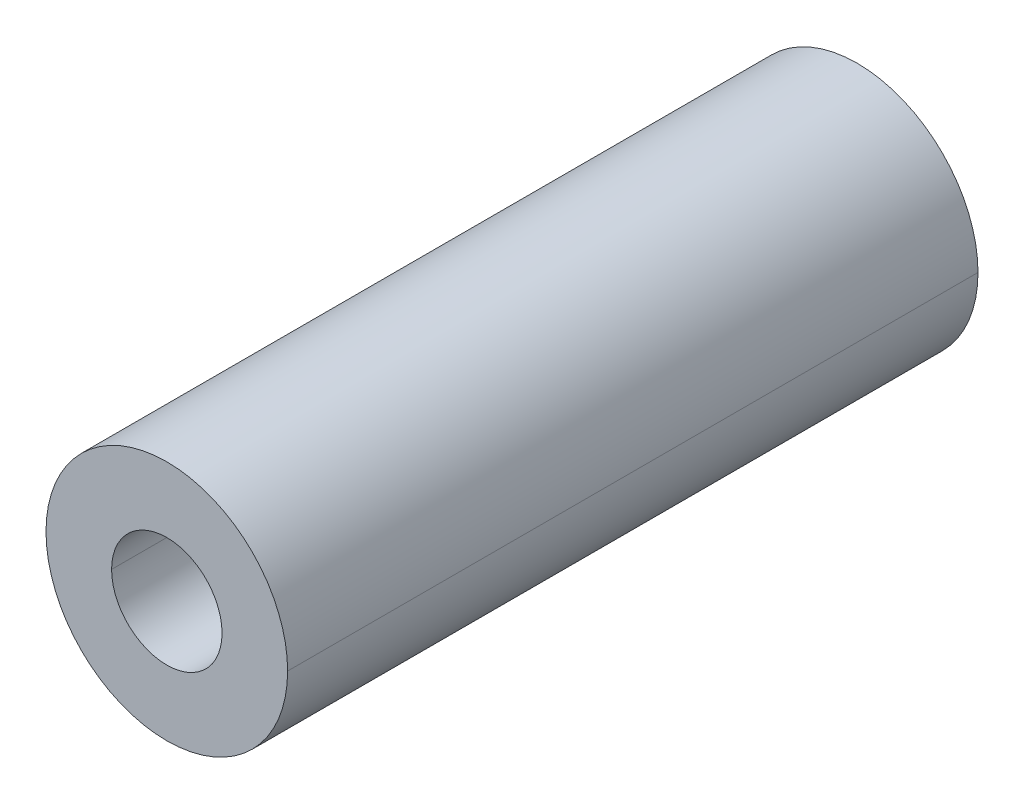
ISO-10303-21;
HEADER;
FILE_DESCRIPTION(('STEP AP214'),'2;1');
FILE_NAME('part.step','',(''),(''),'','','');
FILE_SCHEMA(('AUTOMOTIVE_DESIGN { 1 0 10303 214 1 1 1 1 }'));
ENDSEC;
DATA;
#1=APPLICATION_CONTEXT('core data for automotive mechanical design processes');
#2=APPLICATION_PROTOCOL_DEFINITION('international standard','automotive_design',2000,#1);
#3=PRODUCT_CONTEXT('',#1,'mechanical');
#4=PRODUCT('Part','Part','',(#3));
#5=PRODUCT_RELATED_PRODUCT_CATEGORY('part','',(#4));
#6=PRODUCT_DEFINITION_FORMATION('','',#4);
#7=PRODUCT_DEFINITION_CONTEXT('part definition',#1,'design');
#8=PRODUCT_DEFINITION('design','',#6,#7);
#9=PRODUCT_DEFINITION_SHAPE('','',#8);
#10=(LENGTH_UNIT() NAMED_UNIT(*) SI_UNIT(.MILLI.,.METRE.));
#11=(NAMED_UNIT(*) PLANE_ANGLE_UNIT() SI_UNIT($,.RADIAN.));
#12=(NAMED_UNIT(*) SI_UNIT($,.STERADIAN.) SOLID_ANGLE_UNIT());
#13=UNCERTAINTY_MEASURE_WITH_UNIT(LENGTH_MEASURE(1.E-05),#10,'distance_accuracy_value','');
#14=(GEOMETRIC_REPRESENTATION_CONTEXT(3) GLOBAL_UNCERTAINTY_ASSIGNED_CONTEXT((#13)) GLOBAL_UNIT_ASSIGNED_CONTEXT((#10,
#11,#12)) REPRESENTATION_CONTEXT('',''));
#15=CARTESIAN_POINT('',(0.,0.,0.));
#16=DIRECTION('',(0.,0.,1.));
#17=DIRECTION('',(1.,0.,0.));
#18=AXIS2_PLACEMENT_3D('',#15,#16,#17);
#19=CARTESIAN_POINT('',(0.,0.,0.));
#20=DIRECTION('',(0.,0.,1.));
#21=DIRECTION('',(-1.,0.,0.));
#22=AXIS2_PLACEMENT_3D('',#19,#20,#21);
#23=CYLINDRICAL_SURFACE('',#22,1.6);
#24=DIRECTION('',(0.,0.,1.));
#25=VECTOR('',#24,1.);
#26=CARTESIAN_POINT('',(-1.6,0.,0.));
#27=LINE('',#26,#25);
#28=CARTESIAN_POINT('',(-1.6,0.,0.));
#29=VERTEX_POINT('',#28);
#30=CARTESIAN_POINT('',(-1.6,0.,20.));
#31=VERTEX_POINT('',#30);
#32=EDGE_CURVE('E24',#29,#31,#27,.T.);
#33=ORIENTED_EDGE('',*,*,#32,.T.);
#34=CARTESIAN_POINT('',(0.,0.,20.));
#35=DIRECTION('',(0.,0.,-1.));
#36=DIRECTION('',(1.,0.,0.));
#37=AXIS2_PLACEMENT_3D('',#34,#35,#36);
#38=CIRCLE('',#37,1.6);
#39=CARTESIAN_POINT('',(1.6,0.,20.));
#40=VERTEX_POINT('',#39);
#41=EDGE_CURVE('E31',#40,#31,#38,.T.);
#42=ORIENTED_EDGE('',*,*,#41,.F.);
#43=DIRECTION('',(0.,0.,1.));
#44=VECTOR('',#43,1.);
#45=CARTESIAN_POINT('',(1.6,0.,0.));
#46=LINE('',#45,#44);
#47=CARTESIAN_POINT('',(1.6,0.,0.));
#48=VERTEX_POINT('',#47);
#49=EDGE_CURVE('E11',#48,#40,#46,.T.);
#50=ORIENTED_EDGE('',*,*,#49,.F.);
#51=CARTESIAN_POINT('',(0.,0.,0.));
#52=DIRECTION('',(0.,0.,-1.));
#53=DIRECTION('',(1.,0.,0.));
#54=AXIS2_PLACEMENT_3D('',#51,#52,#53);
#55=CIRCLE('',#54,1.6);
#56=EDGE_CURVE('E71',#48,#29,#55,.T.);
#57=ORIENTED_EDGE('',*,*,#56,.T.);
#58=EDGE_LOOP('',(#33,#42,#50,#57));
#59=FACE_BOUND('',#58,.T.);
#60=ADVANCED_FACE('F17',(#59),#23,.F.);
#61=CARTESIAN_POINT('',(0.,0.,0.));
#62=DIRECTION('',(0.,0.,1.));
#63=DIRECTION('',(-1.,0.,0.));
#64=AXIS2_PLACEMENT_3D('',#61,#62,#63);
#65=CYLINDRICAL_SURFACE('',#64,1.6);
#66=ORIENTED_EDGE('',*,*,#49,.T.);
#67=CARTESIAN_POINT('',(0.,0.,20.));
#68=DIRECTION('',(0.,0.,-1.));
#69=DIRECTION('',(-1.,0.,0.));
#70=AXIS2_PLACEMENT_3D('',#67,#68,#69);
#71=CIRCLE('',#70,1.6);
#72=EDGE_CURVE('E83',#31,#40,#71,.T.);
#73=ORIENTED_EDGE('',*,*,#72,.F.);
#74=ORIENTED_EDGE('',*,*,#32,.F.);
#75=CARTESIAN_POINT('',(0.,0.,0.));
#76=DIRECTION('',(0.,0.,-1.));
#77=DIRECTION('',(-1.,0.,0.));
#78=AXIS2_PLACEMENT_3D('',#75,#76,#77);
#79=CIRCLE('',#78,1.6);
#80=EDGE_CURVE('E65',#29,#48,#79,.T.);
#81=ORIENTED_EDGE('',*,*,#80,.T.);
#82=EDGE_LOOP('',(#66,#73,#74,#81));
#83=FACE_BOUND('',#82,.T.);
#84=ADVANCED_FACE('F90',(#83),#65,.F.);
#85=CARTESIAN_POINT('',(0.,0.,20.));
#86=DIRECTION('',(0.,0.,1.));
#87=DIRECTION('',(-1.,0.,0.));
#88=AXIS2_PLACEMENT_3D('',#85,#86,#87);
#89=PLANE('',#88);
#90=ORIENTED_EDGE('',*,*,#41,.T.);
#91=ORIENTED_EDGE('',*,*,#72,.T.);
#92=EDGE_LOOP('',(#90,#91));
#93=FACE_BOUND('',#92,.T.);
#94=CARTESIAN_POINT('',(0.,0.,20.));
#95=DIRECTION('',(0.,0.,1.));
#96=DIRECTION('',(1.,0.,0.));
#97=AXIS2_PLACEMENT_3D('',#94,#95,#96);
#98=CIRCLE('',#97,3.5);
#99=CARTESIAN_POINT('',(3.5,0.,20.));
#100=VERTEX_POINT('',#99);
#101=CARTESIAN_POINT('',(-3.5,0.,20.));
#102=VERTEX_POINT('',#101);
#103=EDGE_CURVE('E80',#100,#102,#98,.T.);
#104=ORIENTED_EDGE('',*,*,#103,.T.);
#105=CARTESIAN_POINT('',(0.,0.,20.));
#106=DIRECTION('',(0.,0.,1.));
#107=DIRECTION('',(-1.,0.,0.));
#108=AXIS2_PLACEMENT_3D('',#105,#106,#107);
#109=CIRCLE('',#108,3.5);
#110=EDGE_CURVE('E70',#102,#100,#109,.T.);
#111=ORIENTED_EDGE('',*,*,#110,.T.);
#112=EDGE_LOOP('',(#104,#111));
#113=FACE_BOUND('',#112,.T.);
#114=ADVANCED_FACE('F87',(#93,#113),#89,.T.);
#115=CARTESIAN_POINT('',(0.,0.,0.));
#116=DIRECTION('',(0.,0.,1.));
#117=DIRECTION('',(-1.,0.,0.));
#118=AXIS2_PLACEMENT_3D('',#115,#116,#117);
#119=CYLINDRICAL_SURFACE('',#118,3.5);
#120=DIRECTION('',(0.,0.,1.));
#121=VECTOR('',#120,1.);
#122=CARTESIAN_POINT('',(-3.5,0.,0.));
#123=LINE('',#122,#121);
#124=CARTESIAN_POINT('',(-3.5,0.,0.));
#125=VERTEX_POINT('',#124);
#126=EDGE_CURVE('E58',#125,#102,#123,.T.);
#127=ORIENTED_EDGE('',*,*,#126,.T.);
#128=ORIENTED_EDGE('',*,*,#103,.F.);
#129=DIRECTION('',(0.,0.,1.));
#130=VECTOR('',#129,1.);
#131=CARTESIAN_POINT('',(3.5,0.,0.));
#132=LINE('',#131,#130);
#133=CARTESIAN_POINT('',(3.5,0.,0.));
#134=VERTEX_POINT('',#133);
#135=EDGE_CURVE('E61',#134,#100,#132,.T.);
#136=ORIENTED_EDGE('',*,*,#135,.F.);
#137=CARTESIAN_POINT('',(0.,0.,0.));
#138=DIRECTION('',(0.,0.,1.));
#139=DIRECTION('',(1.,0.,0.));
#140=AXIS2_PLACEMENT_3D('',#137,#138,#139);
#141=CIRCLE('',#140,3.5);
#142=EDGE_CURVE('E54',#134,#125,#141,.T.);
#143=ORIENTED_EDGE('',*,*,#142,.T.);
#144=EDGE_LOOP('',(#127,#128,#136,#143));
#145=FACE_BOUND('',#144,.T.);
#146=ADVANCED_FACE('F56',(#145),#119,.T.);
#147=CARTESIAN_POINT('',(0.,0.,0.));
#148=DIRECTION('',(0.,0.,1.));
#149=DIRECTION('',(-1.,0.,0.));
#150=AXIS2_PLACEMENT_3D('',#147,#148,#149);
#151=CYLINDRICAL_SURFACE('',#150,3.5);
#152=ORIENTED_EDGE('',*,*,#135,.T.);
#153=ORIENTED_EDGE('',*,*,#110,.F.);
#154=ORIENTED_EDGE('',*,*,#126,.F.);
#155=CARTESIAN_POINT('',(0.,0.,0.));
#156=DIRECTION('',(0.,0.,1.));
#157=DIRECTION('',(-1.,0.,0.));
#158=AXIS2_PLACEMENT_3D('',#155,#156,#157);
#159=CIRCLE('',#158,3.5);
#160=EDGE_CURVE('E66',#125,#134,#159,.T.);
#161=ORIENTED_EDGE('',*,*,#160,.T.);
#162=EDGE_LOOP('',(#152,#153,#154,#161));
#163=FACE_BOUND('',#162,.T.);
#164=ADVANCED_FACE('F69',(#163),#151,.T.);
#165=CARTESIAN_POINT('',(0.,0.,0.));
#166=DIRECTION('',(0.,0.,1.));
#167=DIRECTION('',(-1.,0.,0.));
#168=AXIS2_PLACEMENT_3D('',#165,#166,#167);
#169=PLANE('',#168);
#170=ORIENTED_EDGE('',*,*,#56,.F.);
#171=ORIENTED_EDGE('',*,*,#80,.F.);
#172=EDGE_LOOP('',(#170,#171));
#173=FACE_BOUND('',#172,.T.);
#174=ORIENTED_EDGE('',*,*,#142,.F.);
#175=ORIENTED_EDGE('',*,*,#160,.F.);
#176=EDGE_LOOP('',(#174,#175));
#177=FACE_BOUND('',#176,.T.);
#178=ADVANCED_FACE('F73',(#173,#177),#169,.F.);
#179=CLOSED_SHELL('',(#60,#84,#114,#146,#164,#178));
#180=MANIFOLD_SOLID_BREP('B1',#179);
#181=ADVANCED_BREP_SHAPE_REPRESENTATION('',(#18,#180),#14);
#182=SHAPE_DEFINITION_REPRESENTATION(#9,#181);
ENDSEC;
END-ISO-10303-21;
